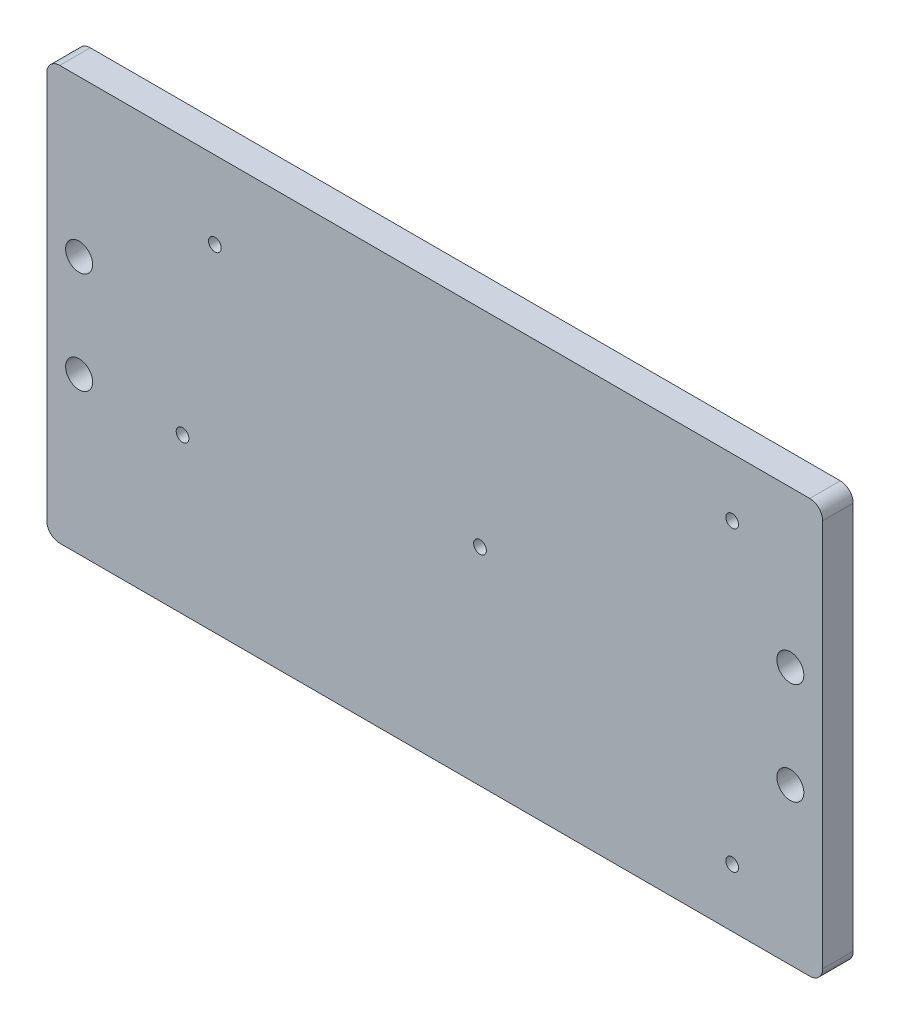
ISO-10303-21;
HEADER;
FILE_DESCRIPTION(('STEP AP214'),'2;1');
FILE_NAME('part.step','',(''),(''),'','','');
FILE_SCHEMA(('AUTOMOTIVE_DESIGN { 1 0 10303 214 1 1 1 1 }'));
ENDSEC;
DATA;
#1=APPLICATION_CONTEXT('core data for automotive mechanical design processes');
#2=APPLICATION_PROTOCOL_DEFINITION('international standard','automotive_design',2000,#1);
#3=PRODUCT_CONTEXT('',#1,'mechanical');
#4=PRODUCT('Part','Part','',(#3));
#5=PRODUCT_RELATED_PRODUCT_CATEGORY('part','',(#4));
#6=PRODUCT_DEFINITION_FORMATION('','',#4);
#7=PRODUCT_DEFINITION_CONTEXT('part definition',#1,'design');
#8=PRODUCT_DEFINITION('design','',#6,#7);
#9=PRODUCT_DEFINITION_SHAPE('','',#8);
#10=(LENGTH_UNIT() NAMED_UNIT(*) SI_UNIT(.MILLI.,.METRE.));
#11=(NAMED_UNIT(*) PLANE_ANGLE_UNIT() SI_UNIT($,.RADIAN.));
#12=(NAMED_UNIT(*) SI_UNIT($,.STERADIAN.) SOLID_ANGLE_UNIT());
#13=UNCERTAINTY_MEASURE_WITH_UNIT(LENGTH_MEASURE(1.E-05),#10,'distance_accuracy_value','');
#14=(GEOMETRIC_REPRESENTATION_CONTEXT(3) GLOBAL_UNCERTAINTY_ASSIGNED_CONTEXT((#13)) GLOBAL_UNIT_ASSIGNED_CONTEXT((#10,
#11,#12)) REPRESENTATION_CONTEXT('',''));
#15=CARTESIAN_POINT('',(0.,0.,0.));
#16=DIRECTION('',(0.,0.,1.));
#17=DIRECTION('',(1.,0.,0.));
#18=AXIS2_PLACEMENT_3D('',#15,#16,#17);
#19=CARTESIAN_POINT('',(378.1171,432.2064,-11.999999876));
#20=DIRECTION('',(0.,0.,1.));
#21=DIRECTION('',(1.,0.,0.));
#22=AXIS2_PLACEMENT_3D('',#19,#20,#21);
#23=PLANE('',#22);
#24=CARTESIAN_POINT('',(510.1971,423.3164,-11.999999876));
#25=DIRECTION('',(0.,0.,-1.));
#26=DIRECTION('',(-1.,0.,0.));
#27=AXIS2_PLACEMENT_3D('',#24,#25,#26);
#28=CIRCLE('',#27,1.24999999999997);
#29=CARTESIAN_POINT('',(508.9471,423.3164,-11.999999876));
#30=VERTEX_POINT('',#29);
#31=EDGE_CURVE('E236',#30,#30,#28,.T.);
#32=ORIENTED_EDGE('',*,*,#31,.T.);
#33=EDGE_LOOP('',(#32));
#34=FACE_BOUND('',#33,.T.);
#35=CARTESIAN_POINT('',(378.1171,432.2064,-11.999999876));
#36=DIRECTION('',(0.,0.,-1.));
#37=DIRECTION('',(1.,0.,0.));
#38=AXIS2_PLACEMENT_3D('',#35,#36,#37);
#39=CIRCLE('',#38,2.53999999999999);
#40=CARTESIAN_POINT('',(375.5771,432.2064,-11.999999876));
#41=VERTEX_POINT('',#40);
#42=CARTESIAN_POINT('',(378.1171,434.7464,-11.999999876));
#43=VERTEX_POINT('',#42);
#44=EDGE_CURVE('E141',#41,#43,#39,.T.);
#45=ORIENTED_EDGE('',*,*,#44,.F.);
#46=DIRECTION('',(0.,1.,0.));
#47=VECTOR('',#46,1.);
#48=CARTESIAN_POINT('',(375.5771,432.2064,-11.999999876));
#49=LINE('',#48,#47);
#50=CARTESIAN_POINT('',(375.5771,356.0064,-11.999999876));
#51=VERTEX_POINT('',#50);
#52=EDGE_CURVE('E95',#51,#41,#49,.T.);
#53=ORIENTED_EDGE('',*,*,#52,.F.);
#54=CARTESIAN_POINT('',(378.1171,356.0064,-11.999999876));
#55=DIRECTION('',(0.,0.,-1.));
#56=DIRECTION('',(-1.,0.,0.));
#57=AXIS2_PLACEMENT_3D('',#54,#55,#56);
#58=CIRCLE('',#57,2.53999999999999);
#59=CARTESIAN_POINT('',(378.1171,353.4664,-11.999999876));
#60=VERTEX_POINT('',#59);
#61=EDGE_CURVE('E89',#60,#51,#58,.T.);
#62=ORIENTED_EDGE('',*,*,#61,.F.);
#63=DIRECTION('',(-1.,0.,0.));
#64=VECTOR('',#63,1.);
#65=CARTESIAN_POINT('',(525.4371,353.4664,-11.999999876));
#66=LINE('',#65,#64);
#67=CARTESIAN_POINT('',(525.4371,353.4664,-11.999999876));
#68=VERTEX_POINT('',#67);
#69=EDGE_CURVE('E131',#68,#60,#66,.T.);
#70=ORIENTED_EDGE('',*,*,#69,.F.);
#71=CARTESIAN_POINT('',(525.4371,356.0064,-11.999999876));
#72=DIRECTION('',(0.,0.,-1.));
#73=DIRECTION('',(-1.,0.,0.));
#74=AXIS2_PLACEMENT_3D('',#71,#72,#73);
#75=CIRCLE('',#74,2.53999999999999);
#76=CARTESIAN_POINT('',(527.9771,356.0064,-11.999999876));
#77=VERTEX_POINT('',#76);
#78=EDGE_CURVE('E151',#77,#68,#75,.T.);
#79=ORIENTED_EDGE('',*,*,#78,.F.);
#80=DIRECTION('',(0.,-1.,0.));
#81=VECTOR('',#80,1.);
#82=CARTESIAN_POINT('',(527.9771,432.2064,-11.999999876));
#83=LINE('',#82,#81);
#84=CARTESIAN_POINT('',(527.9771,432.2064,-11.999999876));
#85=VERTEX_POINT('',#84);
#86=EDGE_CURVE('E149',#85,#77,#83,.T.);
#87=ORIENTED_EDGE('',*,*,#86,.F.);
#88=CARTESIAN_POINT('',(525.4371,432.2064,-11.999999876));
#89=DIRECTION('',(0.,0.,-1.));
#90=DIRECTION('',(-1.,0.,0.));
#91=AXIS2_PLACEMENT_3D('',#88,#89,#90);
#92=CIRCLE('',#91,2.53999999999999);
#93=CARTESIAN_POINT('',(525.4371,434.7464,-11.999999876));
#94=VERTEX_POINT('',#93);
#95=EDGE_CURVE('E147',#94,#85,#92,.T.);
#96=ORIENTED_EDGE('',*,*,#95,.F.);
#97=DIRECTION('',(1.,0.,0.));
#98=VECTOR('',#97,1.);
#99=CARTESIAN_POINT('',(525.4371,434.7464,-11.999999876));
#100=LINE('',#99,#98);
#101=EDGE_CURVE('E144',#43,#94,#100,.T.);
#102=ORIENTED_EDGE('',*,*,#101,.F.);
#103=EDGE_LOOP('',(#45,#53,#62,#70,#79,#87,#96,#102));
#104=FACE_BOUND('',#103,.T.);
#105=CARTESIAN_POINT('',(381.9271,404.106399939,-11.999999876));
#106=DIRECTION('',(0.,0.,-1.));
#107=DIRECTION('',(-1.,0.,0.));
#108=AXIS2_PLACEMENT_3D('',#105,#106,#107);
#109=CIRCLE('',#108,2.64999999999999);
#110=CARTESIAN_POINT('',(379.2771,404.106399939,-11.999999876));
#111=VERTEX_POINT('',#110);
#112=EDGE_CURVE('E145',#111,#111,#109,.T.);
#113=ORIENTED_EDGE('',*,*,#112,.T.);
#114=EDGE_LOOP('',(#113));
#115=FACE_BOUND('',#114,.T.);
#116=CARTESIAN_POINT('',(381.9271,384.106400061,-11.999999876));
#117=DIRECTION('',(0.,0.,-1.));
#118=DIRECTION('',(-1.,0.,0.));
#119=AXIS2_PLACEMENT_3D('',#116,#117,#118);
#120=CIRCLE('',#119,2.64999999999999);
#121=CARTESIAN_POINT('',(379.2771,384.106400061,-11.999999876));
#122=VERTEX_POINT('',#121);
#123=EDGE_CURVE('E194',#122,#122,#120,.T.);
#124=ORIENTED_EDGE('',*,*,#123,.T.);
#125=EDGE_LOOP('',(#124));
#126=FACE_BOUND('',#125,.T.);
#127=CARTESIAN_POINT('',(521.6271,384.106400061,-11.999999876));
#128=DIRECTION('',(0.,0.,-1.));
#129=DIRECTION('',(-1.,0.,0.));
#130=AXIS2_PLACEMENT_3D('',#127,#128,#129);
#131=CIRCLE('',#130,2.65000000000004);
#132=CARTESIAN_POINT('',(518.9771,384.106400061,-11.999999876));
#133=VERTEX_POINT('',#132);
#134=EDGE_CURVE('E200',#133,#133,#131,.T.);
#135=ORIENTED_EDGE('',*,*,#134,.T.);
#136=EDGE_LOOP('',(#135));
#137=FACE_BOUND('',#136,.T.);
#138=CARTESIAN_POINT('',(521.6271,404.106399939,-11.999999876));
#139=DIRECTION('',(0.,0.,-1.));
#140=DIRECTION('',(-1.,0.,0.));
#141=AXIS2_PLACEMENT_3D('',#138,#139,#140);
#142=CIRCLE('',#141,2.65000000000004);
#143=CARTESIAN_POINT('',(518.9771,404.106399939,-11.999999876));
#144=VERTEX_POINT('',#143);
#145=EDGE_CURVE('E206',#144,#144,#142,.T.);
#146=ORIENTED_EDGE('',*,*,#145,.T.);
#147=EDGE_LOOP('',(#146));
#148=FACE_BOUND('',#147,.T.);
#149=CARTESIAN_POINT('',(510.1971,364.8964,-11.999999876));
#150=DIRECTION('',(0.,0.,-1.));
#151=DIRECTION('',(-1.,0.,0.));
#152=AXIS2_PLACEMENT_3D('',#149,#150,#151);
#153=CIRCLE('',#152,1.24999999999997);
#154=CARTESIAN_POINT('',(508.9471,364.8964,-11.999999876));
#155=VERTEX_POINT('',#154);
#156=EDGE_CURVE('E212',#155,#155,#153,.T.);
#157=ORIENTED_EDGE('',*,*,#156,.T.);
#158=EDGE_LOOP('',(#157));
#159=FACE_BOUND('',#158,.T.);
#160=CARTESIAN_POINT('',(402.2471,383.9464,-11.999999876));
#161=DIRECTION('',(0.,0.,-1.));
#162=DIRECTION('',(-1.,0.,0.));
#163=AXIS2_PLACEMENT_3D('',#160,#161,#162);
#164=CIRCLE('',#163,1.24999999999997);
#165=CARTESIAN_POINT('',(400.9971,383.9464,-11.999999876));
#166=VERTEX_POINT('',#165);
#167=EDGE_CURVE('E218',#166,#166,#164,.T.);
#168=ORIENTED_EDGE('',*,*,#167,.T.);
#169=EDGE_LOOP('',(#168));
#170=FACE_BOUND('',#169,.T.);
#171=CARTESIAN_POINT('',(460.6671,394.1064,-11.999999876));
#172=DIRECTION('',(0.,0.,-1.));
#173=DIRECTION('',(-1.,0.,0.));
#174=AXIS2_PLACEMENT_3D('',#171,#172,#173);
#175=CIRCLE('',#174,1.24999999999997);
#176=CARTESIAN_POINT('',(459.4171,394.1064,-11.999999876));
#177=VERTEX_POINT('',#176);
#178=EDGE_CURVE('E224',#177,#177,#175,.T.);
#179=ORIENTED_EDGE('',*,*,#178,.T.);
#180=EDGE_LOOP('',(#179));
#181=FACE_BOUND('',#180,.T.);
#182=CARTESIAN_POINT('',(408.5971,419.5064,-11.999999876));
#183=DIRECTION('',(0.,0.,-1.));
#184=DIRECTION('',(-1.,0.,0.));
#185=AXIS2_PLACEMENT_3D('',#182,#183,#184);
#186=CIRCLE('',#185,1.24999999999997);
#187=CARTESIAN_POINT('',(407.3471,419.5064,-11.999999876));
#188=VERTEX_POINT('',#187);
#189=EDGE_CURVE('E230',#188,#188,#186,.T.);
#190=ORIENTED_EDGE('',*,*,#189,.T.);
#191=EDGE_LOOP('',(#190));
#192=FACE_BOUND('',#191,.T.);
#193=ADVANCED_FACE('F43',(#34,#104,#115,#126,#137,#148,#159,#170,#181,#192),#23,.T.);
#194=CARTESIAN_POINT('',(378.1171,432.2064,-17.999999876));
#195=DIRECTION('',(0.,0.,1.));
#196=DIRECTION('',(1.,0.,0.));
#197=AXIS2_PLACEMENT_3D('',#194,#195,#196);
#198=PLANE('',#197);
#199=CARTESIAN_POINT('',(510.1971,423.3164,-17.999999876));
#200=DIRECTION('',(0.,0.,-1.));
#201=DIRECTION('',(-1.,0.,0.));
#202=AXIS2_PLACEMENT_3D('',#199,#200,#201);
#203=CIRCLE('',#202,1.24999999999997);
#204=CARTESIAN_POINT('',(508.9471,423.3164,-17.999999876));
#205=VERTEX_POINT('',#204);
#206=EDGE_CURVE('E239',#205,#205,#203,.T.);
#207=ORIENTED_EDGE('',*,*,#206,.F.);
#208=EDGE_LOOP('',(#207));
#209=FACE_BOUND('',#208,.T.);
#210=CARTESIAN_POINT('',(408.5971,419.5064,-17.999999876));
#211=DIRECTION('',(0.,0.,-1.));
#212=DIRECTION('',(-1.,0.,0.));
#213=AXIS2_PLACEMENT_3D('',#210,#211,#212);
#214=CIRCLE('',#213,1.24999999999997);
#215=CARTESIAN_POINT('',(407.3471,419.5064,-17.999999876));
#216=VERTEX_POINT('',#215);
#217=EDGE_CURVE('E233',#216,#216,#214,.T.);
#218=ORIENTED_EDGE('',*,*,#217,.F.);
#219=EDGE_LOOP('',(#218));
#220=FACE_BOUND('',#219,.T.);
#221=CARTESIAN_POINT('',(460.6671,394.1064,-17.999999876));
#222=DIRECTION('',(0.,0.,-1.));
#223=DIRECTION('',(-1.,0.,0.));
#224=AXIS2_PLACEMENT_3D('',#221,#222,#223);
#225=CIRCLE('',#224,1.24999999999997);
#226=CARTESIAN_POINT('',(459.4171,394.1064,-17.999999876));
#227=VERTEX_POINT('',#226);
#228=EDGE_CURVE('E227',#227,#227,#225,.T.);
#229=ORIENTED_EDGE('',*,*,#228,.F.);
#230=EDGE_LOOP('',(#229));
#231=FACE_BOUND('',#230,.T.);
#232=CARTESIAN_POINT('',(402.2471,383.9464,-17.999999876));
#233=DIRECTION('',(0.,0.,-1.));
#234=DIRECTION('',(-1.,0.,0.));
#235=AXIS2_PLACEMENT_3D('',#232,#233,#234);
#236=CIRCLE('',#235,1.24999999999997);
#237=CARTESIAN_POINT('',(400.9971,383.9464,-17.999999876));
#238=VERTEX_POINT('',#237);
#239=EDGE_CURVE('E221',#238,#238,#236,.T.);
#240=ORIENTED_EDGE('',*,*,#239,.F.);
#241=EDGE_LOOP('',(#240));
#242=FACE_BOUND('',#241,.T.);
#243=CARTESIAN_POINT('',(510.1971,364.8964,-17.999999876));
#244=DIRECTION('',(0.,0.,-1.));
#245=DIRECTION('',(-1.,0.,0.));
#246=AXIS2_PLACEMENT_3D('',#243,#244,#245);
#247=CIRCLE('',#246,1.24999999999997);
#248=CARTESIAN_POINT('',(508.9471,364.8964,-17.999999876));
#249=VERTEX_POINT('',#248);
#250=EDGE_CURVE('E215',#249,#249,#247,.T.);
#251=ORIENTED_EDGE('',*,*,#250,.F.);
#252=EDGE_LOOP('',(#251));
#253=FACE_BOUND('',#252,.T.);
#254=CARTESIAN_POINT('',(521.6271,384.106400061,-17.999999876));
#255=DIRECTION('',(0.,0.,-1.));
#256=DIRECTION('',(-1.,0.,0.));
#257=AXIS2_PLACEMENT_3D('',#254,#255,#256);
#258=CIRCLE('',#257,2.65000000000004);
#259=CARTESIAN_POINT('',(518.9771,384.106400061,-17.999999876));
#260=VERTEX_POINT('',#259);
#261=EDGE_CURVE('E203',#260,#260,#258,.T.);
#262=ORIENTED_EDGE('',*,*,#261,.F.);
#263=EDGE_LOOP('',(#262));
#264=FACE_BOUND('',#263,.T.);
#265=CARTESIAN_POINT('',(381.9271,384.106400061,-17.999999876));
#266=DIRECTION('',(0.,0.,-1.));
#267=DIRECTION('',(-1.,0.,0.));
#268=AXIS2_PLACEMENT_3D('',#265,#266,#267);
#269=CIRCLE('',#268,2.64999999999999);
#270=CARTESIAN_POINT('',(379.2771,384.106400061,-17.999999876));
#271=VERTEX_POINT('',#270);
#272=EDGE_CURVE('E197',#271,#271,#269,.T.);
#273=ORIENTED_EDGE('',*,*,#272,.F.);
#274=EDGE_LOOP('',(#273));
#275=FACE_BOUND('',#274,.T.);
#276=CARTESIAN_POINT('',(381.9271,404.106399939,-17.999999876));
#277=DIRECTION('',(0.,0.,-1.));
#278=DIRECTION('',(-1.,0.,0.));
#279=AXIS2_PLACEMENT_3D('',#276,#277,#278);
#280=CIRCLE('',#279,2.64999999999999);
#281=CARTESIAN_POINT('',(379.2771,404.106399939,-17.999999876));
#282=VERTEX_POINT('',#281);
#283=EDGE_CURVE('E191',#282,#282,#280,.T.);
#284=ORIENTED_EDGE('',*,*,#283,.F.);
#285=EDGE_LOOP('',(#284));
#286=FACE_BOUND('',#285,.T.);
#287=CARTESIAN_POINT('',(378.1171,432.2064,-17.999999876));
#288=DIRECTION('',(0.,0.,-1.));
#289=DIRECTION('',(1.,0.,0.));
#290=AXIS2_PLACEMENT_3D('',#287,#288,#289);
#291=CIRCLE('',#290,2.53999999999999);
#292=CARTESIAN_POINT('',(375.5771,432.2064,-17.999999876));
#293=VERTEX_POINT('',#292);
#294=CARTESIAN_POINT('',(378.1171,434.7464,-17.999999876));
#295=VERTEX_POINT('',#294);
#296=EDGE_CURVE('E156',#293,#295,#291,.T.);
#297=ORIENTED_EDGE('',*,*,#296,.T.);
#298=DIRECTION('',(1.,0.,0.));
#299=VECTOR('',#298,1.);
#300=CARTESIAN_POINT('',(525.4371,434.7464,-17.999999876));
#301=LINE('',#300,#299);
#302=CARTESIAN_POINT('',(525.4371,434.7464,-17.999999876));
#303=VERTEX_POINT('',#302);
#304=EDGE_CURVE('E103',#295,#303,#301,.T.);
#305=ORIENTED_EDGE('',*,*,#304,.T.);
#306=CARTESIAN_POINT('',(525.4371,432.2064,-17.999999876));
#307=DIRECTION('',(0.,0.,-1.));
#308=DIRECTION('',(-1.,0.,0.));
#309=AXIS2_PLACEMENT_3D('',#306,#307,#308);
#310=CIRCLE('',#309,2.53999999999999);
#311=CARTESIAN_POINT('',(527.9771,432.2064,-17.999999876));
#312=VERTEX_POINT('',#311);
#313=EDGE_CURVE('E171',#303,#312,#310,.T.);
#314=ORIENTED_EDGE('',*,*,#313,.T.);
#315=DIRECTION('',(0.,-1.,0.));
#316=VECTOR('',#315,1.);
#317=CARTESIAN_POINT('',(527.9771,432.2064,-17.999999876));
#318=LINE('',#317,#316);
#319=CARTESIAN_POINT('',(527.9771,356.0064,-17.999999876));
#320=VERTEX_POINT('',#319);
#321=EDGE_CURVE('E183',#312,#320,#318,.T.);
#322=ORIENTED_EDGE('',*,*,#321,.T.);
#323=CARTESIAN_POINT('',(525.4371,356.0064,-17.999999876));
#324=DIRECTION('',(0.,0.,-1.));
#325=DIRECTION('',(-1.,0.,0.));
#326=AXIS2_PLACEMENT_3D('',#323,#324,#325);
#327=CIRCLE('',#326,2.53999999999999);
#328=CARTESIAN_POINT('',(525.4371,353.4664,-17.999999876));
#329=VERTEX_POINT('',#328);
#330=EDGE_CURVE('E123',#320,#329,#327,.T.);
#331=ORIENTED_EDGE('',*,*,#330,.T.);
#332=DIRECTION('',(-1.,0.,0.));
#333=VECTOR('',#332,1.);
#334=CARTESIAN_POINT('',(525.4371,353.4664,-17.999999876));
#335=LINE('',#334,#333);
#336=CARTESIAN_POINT('',(378.1171,353.4664,-17.999999876));
#337=VERTEX_POINT('',#336);
#338=EDGE_CURVE('E116',#329,#337,#335,.T.);
#339=ORIENTED_EDGE('',*,*,#338,.T.);
#340=CARTESIAN_POINT('',(378.1171,356.0064,-17.999999876));
#341=DIRECTION('',(0.,0.,-1.));
#342=DIRECTION('',(-1.,0.,0.));
#343=AXIS2_PLACEMENT_3D('',#340,#341,#342);
#344=CIRCLE('',#343,2.53999999999999);
#345=CARTESIAN_POINT('',(375.5771,356.0064,-17.999999876));
#346=VERTEX_POINT('',#345);
#347=EDGE_CURVE('E121',#337,#346,#344,.T.);
#348=ORIENTED_EDGE('',*,*,#347,.T.);
#349=DIRECTION('',(0.,1.,0.));
#350=VECTOR('',#349,1.);
#351=CARTESIAN_POINT('',(375.5771,432.2064,-17.999999876));
#352=LINE('',#351,#350);
#353=EDGE_CURVE('E60',#346,#293,#352,.T.);
#354=ORIENTED_EDGE('',*,*,#353,.T.);
#355=EDGE_LOOP('',(#297,#305,#314,#322,#331,#339,#348,#354));
#356=FACE_BOUND('',#355,.T.);
#357=CARTESIAN_POINT('',(521.6271,404.106399939,-17.999999876));
#358=DIRECTION('',(0.,0.,-1.));
#359=DIRECTION('',(-1.,0.,0.));
#360=AXIS2_PLACEMENT_3D('',#357,#358,#359);
#361=CIRCLE('',#360,2.65000000000004);
#362=CARTESIAN_POINT('',(518.9771,404.106399939,-17.999999876));
#363=VERTEX_POINT('',#362);
#364=EDGE_CURVE('E209',#363,#363,#361,.T.);
#365=ORIENTED_EDGE('',*,*,#364,.F.);
#366=EDGE_LOOP('',(#365));
#367=FACE_BOUND('',#366,.T.);
#368=ADVANCED_FACE('F118',(#209,#220,#231,#242,#253,#264,#275,#286,#356,#367),#198,.F.);
#369=CARTESIAN_POINT('',(378.1171,432.2064,-17.999999876));
#370=DIRECTION('',(0.,0.,1.));
#371=DIRECTION('',(1.,0.,0.));
#372=AXIS2_PLACEMENT_3D('',#369,#370,#371);
#373=CYLINDRICAL_SURFACE('',#372,2.53999999999999);
#374=ORIENTED_EDGE('',*,*,#44,.T.);
#375=DIRECTION('',(0.,0.,1.));
#376=VECTOR('',#375,1.);
#377=CARTESIAN_POINT('',(378.1171,434.7464,-17.999999876));
#378=LINE('',#377,#376);
#379=EDGE_CURVE('E11',#295,#43,#378,.T.);
#380=ORIENTED_EDGE('',*,*,#379,.F.);
#381=ORIENTED_EDGE('',*,*,#296,.F.);
#382=DIRECTION('',(0.,0.,1.));
#383=VECTOR('',#382,1.);
#384=CARTESIAN_POINT('',(375.5771,432.2064,-17.999999876));
#385=LINE('',#384,#383);
#386=EDGE_CURVE('E137',#293,#41,#385,.T.);
#387=ORIENTED_EDGE('',*,*,#386,.T.);
#388=EDGE_LOOP('',(#374,#380,#381,#387));
#389=FACE_BOUND('',#388,.T.);
#390=ADVANCED_FACE('F45',(#389),#373,.T.);
#391=CARTESIAN_POINT('',(525.4371,434.7464,-17.999999876));
#392=DIRECTION('',(0.,-1.,0.));
#393=DIRECTION('',(0.,0.,-1.));
#394=AXIS2_PLACEMENT_3D('',#391,#392,#393);
#395=PLANE('',#394);
#396=ORIENTED_EDGE('',*,*,#101,.T.);
#397=DIRECTION('',(0.,0.,1.));
#398=VECTOR('',#397,1.);
#399=CARTESIAN_POINT('',(525.4371,434.7464,-17.999999876));
#400=LINE('',#399,#398);
#401=EDGE_CURVE('E52',#303,#94,#400,.T.);
#402=ORIENTED_EDGE('',*,*,#401,.F.);
#403=ORIENTED_EDGE('',*,*,#304,.F.);
#404=ORIENTED_EDGE('',*,*,#379,.T.);
#405=EDGE_LOOP('',(#396,#402,#403,#404));
#406=FACE_BOUND('',#405,.T.);
#407=ADVANCED_FACE('F293',(#406),#395,.F.);
#408=CARTESIAN_POINT('',(525.4371,432.2064,-17.999999876));
#409=DIRECTION('',(0.,0.,1.));
#410=DIRECTION('',(1.,0.,0.));
#411=AXIS2_PLACEMENT_3D('',#408,#409,#410);
#412=CYLINDRICAL_SURFACE('',#411,2.53999999999999);
#413=ORIENTED_EDGE('',*,*,#95,.T.);
#414=DIRECTION('',(0.,0.,1.));
#415=VECTOR('',#414,1.);
#416=CARTESIAN_POINT('',(527.9771,432.2064,-17.999999876));
#417=LINE('',#416,#415);
#418=EDGE_CURVE('E163',#312,#85,#417,.T.);
#419=ORIENTED_EDGE('',*,*,#418,.F.);
#420=ORIENTED_EDGE('',*,*,#313,.F.);
#421=ORIENTED_EDGE('',*,*,#401,.T.);
#422=EDGE_LOOP('',(#413,#419,#420,#421));
#423=FACE_BOUND('',#422,.T.);
#424=ADVANCED_FACE('F169',(#423),#412,.T.);
#425=CARTESIAN_POINT('',(527.9771,432.2064,-17.999999876));
#426=DIRECTION('',(-1.,0.,0.));
#427=DIRECTION('',(0.,0.,1.));
#428=AXIS2_PLACEMENT_3D('',#425,#426,#427);
#429=PLANE('',#428);
#430=ORIENTED_EDGE('',*,*,#86,.T.);
#431=DIRECTION('',(0.,0.,1.));
#432=VECTOR('',#431,1.);
#433=CARTESIAN_POINT('',(527.9771,356.0064,-17.999999876));
#434=LINE('',#433,#432);
#435=EDGE_CURVE('E160',#320,#77,#434,.T.);
#436=ORIENTED_EDGE('',*,*,#435,.F.);
#437=ORIENTED_EDGE('',*,*,#321,.F.);
#438=ORIENTED_EDGE('',*,*,#418,.T.);
#439=EDGE_LOOP('',(#430,#436,#437,#438));
#440=FACE_BOUND('',#439,.T.);
#441=ADVANCED_FACE('F179',(#440),#429,.F.);
#442=CARTESIAN_POINT('',(525.4371,356.0064,-17.999999876));
#443=DIRECTION('',(0.,0.,1.));
#444=DIRECTION('',(1.,0.,0.));
#445=AXIS2_PLACEMENT_3D('',#442,#443,#444);
#446=CYLINDRICAL_SURFACE('',#445,2.53999999999999);
#447=ORIENTED_EDGE('',*,*,#78,.T.);
#448=DIRECTION('',(0.,0.,1.));
#449=VECTOR('',#448,1.);
#450=CARTESIAN_POINT('',(525.4371,353.4664,-17.999999876));
#451=LINE('',#450,#449);
#452=EDGE_CURVE('E132',#329,#68,#451,.T.);
#453=ORIENTED_EDGE('',*,*,#452,.F.);
#454=ORIENTED_EDGE('',*,*,#330,.F.);
#455=ORIENTED_EDGE('',*,*,#435,.T.);
#456=EDGE_LOOP('',(#447,#453,#454,#455));
#457=FACE_BOUND('',#456,.T.);
#458=ADVANCED_FACE('F182',(#457),#446,.T.);
#459=CARTESIAN_POINT('',(525.4371,353.4664,-17.999999876));
#460=DIRECTION('',(0.,1.,0.));
#461=DIRECTION('',(0.,0.,1.));
#462=AXIS2_PLACEMENT_3D('',#459,#460,#461);
#463=PLANE('',#462);
#464=ORIENTED_EDGE('',*,*,#69,.T.);
#465=DIRECTION('',(0.,0.,1.));
#466=VECTOR('',#465,1.);
#467=CARTESIAN_POINT('',(378.1171,353.4664,-17.999999876));
#468=LINE('',#467,#466);
#469=EDGE_CURVE('E128',#337,#60,#468,.T.);
#470=ORIENTED_EDGE('',*,*,#469,.F.);
#471=ORIENTED_EDGE('',*,*,#338,.F.);
#472=ORIENTED_EDGE('',*,*,#452,.T.);
#473=EDGE_LOOP('',(#464,#470,#471,#472));
#474=FACE_BOUND('',#473,.T.);
#475=ADVANCED_FACE('F129',(#474),#463,.F.);
#476=CARTESIAN_POINT('',(378.1171,356.0064,-17.999999876));
#477=DIRECTION('',(0.,0.,1.));
#478=DIRECTION('',(1.,0.,0.));
#479=AXIS2_PLACEMENT_3D('',#476,#477,#478);
#480=CYLINDRICAL_SURFACE('',#479,2.53999999999999);
#481=ORIENTED_EDGE('',*,*,#61,.T.);
#482=DIRECTION('',(0.,0.,1.));
#483=VECTOR('',#482,1.);
#484=CARTESIAN_POINT('',(375.5771,356.0064,-17.999999876));
#485=LINE('',#484,#483);
#486=EDGE_CURVE('E133',#346,#51,#485,.T.);
#487=ORIENTED_EDGE('',*,*,#486,.F.);
#488=ORIENTED_EDGE('',*,*,#347,.F.);
#489=ORIENTED_EDGE('',*,*,#469,.T.);
#490=EDGE_LOOP('',(#481,#487,#488,#489));
#491=FACE_BOUND('',#490,.T.);
#492=ADVANCED_FACE('F135',(#491),#480,.T.);
#493=CARTESIAN_POINT('',(375.5771,432.2064,-17.999999876));
#494=DIRECTION('',(1.,0.,0.));
#495=DIRECTION('',(0.,0.,-1.));
#496=AXIS2_PLACEMENT_3D('',#493,#494,#495);
#497=PLANE('',#496);
#498=ORIENTED_EDGE('',*,*,#52,.T.);
#499=ORIENTED_EDGE('',*,*,#386,.F.);
#500=ORIENTED_EDGE('',*,*,#353,.F.);
#501=ORIENTED_EDGE('',*,*,#486,.T.);
#502=EDGE_LOOP('',(#498,#499,#500,#501));
#503=FACE_BOUND('',#502,.T.);
#504=ADVANCED_FACE('F265',(#503),#497,.F.);
#505=CARTESIAN_POINT('',(381.9271,404.106399939,-17.999999876));
#506=DIRECTION('',(0.,0.,-1.));
#507=DIRECTION('',(-1.,0.,0.));
#508=AXIS2_PLACEMENT_3D('',#505,#506,#507);
#509=CYLINDRICAL_SURFACE('',#508,2.64999999999999);
#510=ORIENTED_EDGE('',*,*,#112,.F.);
#511=EDGE_LOOP('',(#510));
#512=FACE_BOUND('',#511,.T.);
#513=ORIENTED_EDGE('',*,*,#283,.T.);
#514=EDGE_LOOP('',(#513));
#515=FACE_BOUND('',#514,.T.);
#516=ADVANCED_FACE('F262',(#512,#515),#509,.F.);
#517=CARTESIAN_POINT('',(381.9271,384.106400061,-17.999999876));
#518=DIRECTION('',(0.,0.,-1.));
#519=DIRECTION('',(-1.,0.,0.));
#520=AXIS2_PLACEMENT_3D('',#517,#518,#519);
#521=CYLINDRICAL_SURFACE('',#520,2.64999999999999);
#522=ORIENTED_EDGE('',*,*,#123,.F.);
#523=EDGE_LOOP('',(#522));
#524=FACE_BOUND('',#523,.T.);
#525=ORIENTED_EDGE('',*,*,#272,.T.);
#526=EDGE_LOOP('',(#525));
#527=FACE_BOUND('',#526,.T.);
#528=ADVANCED_FACE('F264',(#524,#527),#521,.F.);
#529=CARTESIAN_POINT('',(521.6271,384.106400061,-17.999999876));
#530=DIRECTION('',(0.,0.,-1.));
#531=DIRECTION('',(-1.,0.,0.));
#532=AXIS2_PLACEMENT_3D('',#529,#530,#531);
#533=CYLINDRICAL_SURFACE('',#532,2.65000000000004);
#534=ORIENTED_EDGE('',*,*,#134,.F.);
#535=EDGE_LOOP('',(#534));
#536=FACE_BOUND('',#535,.T.);
#537=ORIENTED_EDGE('',*,*,#261,.T.);
#538=EDGE_LOOP('',(#537));
#539=FACE_BOUND('',#538,.T.);
#540=ADVANCED_FACE('F272',(#536,#539),#533,.F.);
#541=CARTESIAN_POINT('',(521.6271,404.106399939,-17.999999876));
#542=DIRECTION('',(0.,0.,-1.));
#543=DIRECTION('',(-1.,0.,0.));
#544=AXIS2_PLACEMENT_3D('',#541,#542,#543);
#545=CYLINDRICAL_SURFACE('',#544,2.65000000000004);
#546=ORIENTED_EDGE('',*,*,#145,.F.);
#547=EDGE_LOOP('',(#546));
#548=FACE_BOUND('',#547,.T.);
#549=ORIENTED_EDGE('',*,*,#364,.T.);
#550=EDGE_LOOP('',(#549));
#551=FACE_BOUND('',#550,.T.);
#552=ADVANCED_FACE('F368',(#548,#551),#545,.F.);
#553=CARTESIAN_POINT('',(510.1971,364.8964,-17.999999876));
#554=DIRECTION('',(0.,0.,-1.));
#555=DIRECTION('',(-1.,0.,0.));
#556=AXIS2_PLACEMENT_3D('',#553,#554,#555);
#557=CYLINDRICAL_SURFACE('',#556,1.24999999999997);
#558=ORIENTED_EDGE('',*,*,#156,.F.);
#559=EDGE_LOOP('',(#558));
#560=FACE_BOUND('',#559,.T.);
#561=ORIENTED_EDGE('',*,*,#250,.T.);
#562=EDGE_LOOP('',(#561));
#563=FACE_BOUND('',#562,.T.);
#564=ADVANCED_FACE('F377',(#560,#563),#557,.F.);
#565=CARTESIAN_POINT('',(402.2471,383.9464,-17.999999876));
#566=DIRECTION('',(0.,0.,-1.));
#567=DIRECTION('',(-1.,0.,0.));
#568=AXIS2_PLACEMENT_3D('',#565,#566,#567);
#569=CYLINDRICAL_SURFACE('',#568,1.24999999999997);
#570=ORIENTED_EDGE('',*,*,#167,.F.);
#571=EDGE_LOOP('',(#570));
#572=FACE_BOUND('',#571,.T.);
#573=ORIENTED_EDGE('',*,*,#239,.T.);
#574=EDGE_LOOP('',(#573));
#575=FACE_BOUND('',#574,.T.);
#576=ADVANCED_FACE('F392',(#572,#575),#569,.F.);
#577=CARTESIAN_POINT('',(460.6671,394.1064,-17.999999876));
#578=DIRECTION('',(0.,0.,-1.));
#579=DIRECTION('',(-1.,0.,0.));
#580=AXIS2_PLACEMENT_3D('',#577,#578,#579);
#581=CYLINDRICAL_SURFACE('',#580,1.24999999999997);
#582=ORIENTED_EDGE('',*,*,#178,.F.);
#583=EDGE_LOOP('',(#582));
#584=FACE_BOUND('',#583,.T.);
#585=ORIENTED_EDGE('',*,*,#228,.T.);
#586=EDGE_LOOP('',(#585));
#587=FACE_BOUND('',#586,.T.);
#588=ADVANCED_FACE('F403',(#584,#587),#581,.F.);
#589=CARTESIAN_POINT('',(408.5971,419.5064,-17.999999876));
#590=DIRECTION('',(0.,0.,-1.));
#591=DIRECTION('',(-1.,0.,0.));
#592=AXIS2_PLACEMENT_3D('',#589,#590,#591);
#593=CYLINDRICAL_SURFACE('',#592,1.24999999999997);
#594=ORIENTED_EDGE('',*,*,#189,.F.);
#595=EDGE_LOOP('',(#594));
#596=FACE_BOUND('',#595,.T.);
#597=ORIENTED_EDGE('',*,*,#217,.T.);
#598=EDGE_LOOP('',(#597));
#599=FACE_BOUND('',#598,.T.);
#600=ADVANCED_FACE('F414',(#596,#599),#593,.F.);
#601=CARTESIAN_POINT('',(510.1971,423.3164,-17.999999876));
#602=DIRECTION('',(0.,0.,-1.));
#603=DIRECTION('',(-1.,0.,0.));
#604=AXIS2_PLACEMENT_3D('',#601,#602,#603);
#605=CYLINDRICAL_SURFACE('',#604,1.24999999999997);
#606=ORIENTED_EDGE('',*,*,#31,.F.);
#607=EDGE_LOOP('',(#606));
#608=FACE_BOUND('',#607,.T.);
#609=ORIENTED_EDGE('',*,*,#206,.T.);
#610=EDGE_LOOP('',(#609));
#611=FACE_BOUND('',#610,.T.);
#612=ADVANCED_FACE('F243',(#608,#611),#605,.F.);
#613=CLOSED_SHELL('',(#193,#368,#390,#407,#424,#441,#458,#475,#492,#504,#516,#528,#540,#552,
#564,#576,#588,#600,#612));
#614=MANIFOLD_SOLID_BREP('B2',#613);
#615=ADVANCED_BREP_SHAPE_REPRESENTATION('',(#18,#614),#14);
#616=SHAPE_DEFINITION_REPRESENTATION(#9,#615);
ENDSEC;
END-ISO-10303-21;
